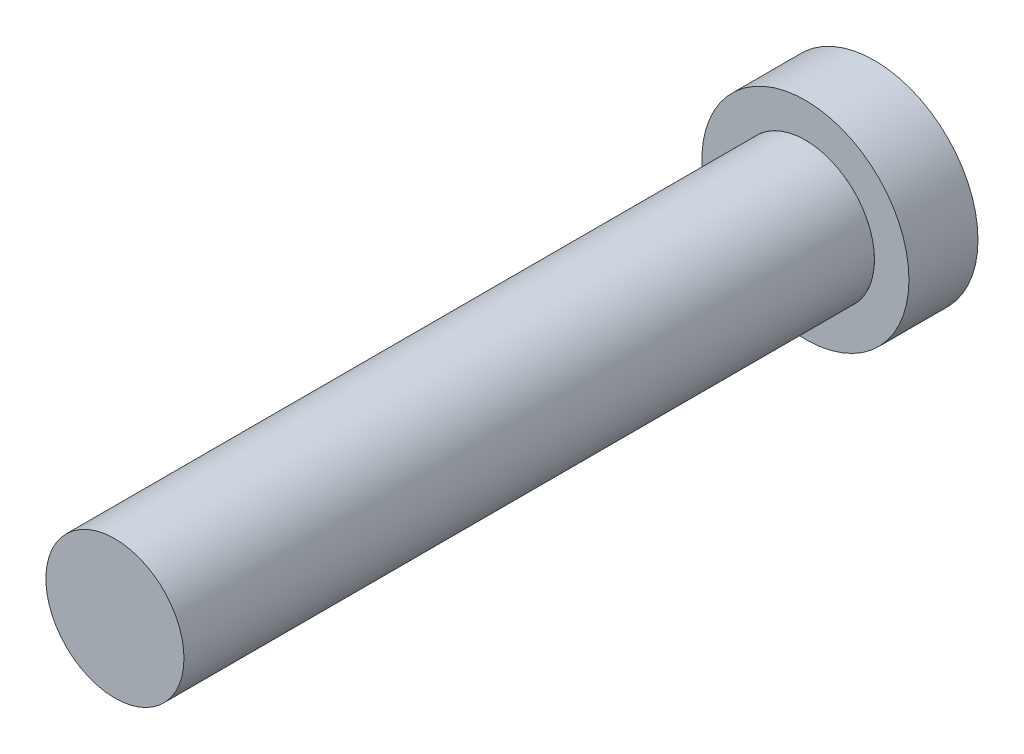
ISO-10303-21;
HEADER;
FILE_DESCRIPTION(('STEP AP214'),'2;1');
FILE_NAME('part.step','',(''),(''),'','','');
FILE_SCHEMA(('AUTOMOTIVE_DESIGN { 1 0 10303 214 1 1 1 1 }'));
ENDSEC;
DATA;
#1=APPLICATION_CONTEXT('core data for automotive mechanical design processes');
#2=APPLICATION_PROTOCOL_DEFINITION('international standard','automotive_design',2000,#1);
#3=PRODUCT_CONTEXT('',#1,'mechanical');
#4=PRODUCT('Part','Part','',(#3));
#5=PRODUCT_RELATED_PRODUCT_CATEGORY('part','',(#4));
#6=PRODUCT_DEFINITION_FORMATION('','',#4);
#7=PRODUCT_DEFINITION_CONTEXT('part definition',#1,'design');
#8=PRODUCT_DEFINITION('design','',#6,#7);
#9=PRODUCT_DEFINITION_SHAPE('','',#8);
#10=(LENGTH_UNIT() NAMED_UNIT(*) SI_UNIT(.MILLI.,.METRE.));
#11=(NAMED_UNIT(*) PLANE_ANGLE_UNIT() SI_UNIT($,.RADIAN.));
#12=(NAMED_UNIT(*) SI_UNIT($,.STERADIAN.) SOLID_ANGLE_UNIT());
#13=UNCERTAINTY_MEASURE_WITH_UNIT(LENGTH_MEASURE(1.E-05),#10,'distance_accuracy_value','');
#14=(GEOMETRIC_REPRESENTATION_CONTEXT(3) GLOBAL_UNCERTAINTY_ASSIGNED_CONTEXT((#13)) GLOBAL_UNIT_ASSIGNED_CONTEXT((#10,
#11,#12)) REPRESENTATION_CONTEXT('',''));
#15=CARTESIAN_POINT('',(0.,0.,0.));
#16=DIRECTION('',(0.,0.,1.));
#17=DIRECTION('',(1.,0.,0.));
#18=AXIS2_PLACEMENT_3D('',#15,#16,#17);
#19=CARTESIAN_POINT('',(0.,0.,-550.));
#20=DIRECTION('',(0.,0.,-1.));
#21=DIRECTION('',(-1.,0.,0.));
#22=AXIS2_PLACEMENT_3D('',#19,#20,#21);
#23=PLANE('',#22);
#24=CARTESIAN_POINT('',(0.,0.,-550.));
#25=DIRECTION('',(0.,0.,-1.));
#26=DIRECTION('',(-1.,0.,0.));
#27=AXIS2_PLACEMENT_3D('',#24,#25,#26);
#28=CIRCLE('',#27,50.);
#29=CARTESIAN_POINT('',(-50.,0.,-550.));
#30=VERTEX_POINT('',#29);
#31=EDGE_CURVE('E11',#30,#30,#28,.T.);
#32=ORIENTED_EDGE('',*,*,#31,.F.);
#33=EDGE_LOOP('',(#32));
#34=FACE_BOUND('',#33,.T.);
#35=CARTESIAN_POINT('',(0.,0.,-550.));
#36=DIRECTION('',(0.,0.,1.));
#37=DIRECTION('',(1.,0.,0.));
#38=AXIS2_PLACEMENT_3D('',#35,#36,#37);
#39=CIRCLE('',#38,75.);
#40=CARTESIAN_POINT('',(75.,0.,-550.));
#41=VERTEX_POINT('',#40);
#42=EDGE_CURVE('E60',#41,#41,#39,.T.);
#43=ORIENTED_EDGE('',*,*,#42,.F.);
#44=EDGE_LOOP('',(#43));
#45=FACE_BOUND('',#44,.T.);
#46=ADVANCED_FACE('F45',(#34,#45),#23,.T.);
#47=CARTESIAN_POINT('',(0.,0.,0.));
#48=DIRECTION('',(0.,0.,1.));
#49=DIRECTION('',(1.,0.,0.));
#50=AXIS2_PLACEMENT_3D('',#47,#48,#49);
#51=CYLINDRICAL_SURFACE('',#50,75.);
#52=ORIENTED_EDGE('',*,*,#42,.T.);
#53=EDGE_LOOP('',(#52));
#54=FACE_BOUND('',#53,.T.);
#55=CARTESIAN_POINT('',(0.,0.,-500.));
#56=DIRECTION('',(0.,0.,1.));
#57=DIRECTION('',(1.,0.,0.));
#58=AXIS2_PLACEMENT_3D('',#55,#56,#57);
#59=CIRCLE('',#58,75.);
#60=CARTESIAN_POINT('',(75.,0.,-500.));
#61=VERTEX_POINT('',#60);
#62=EDGE_CURVE('E56',#61,#61,#59,.T.);
#63=ORIENTED_EDGE('',*,*,#62,.F.);
#64=EDGE_LOOP('',(#63));
#65=FACE_BOUND('',#64,.T.);
#66=ADVANCED_FACE('F64',(#54,#65),#51,.T.);
#67=CARTESIAN_POINT('',(0.,-75.,-500.));
#68=DIRECTION('',(0.,0.,1.));
#69=DIRECTION('',(1.,0.,0.));
#70=AXIS2_PLACEMENT_3D('',#67,#68,#69);
#71=PLANE('',#70);
#72=ORIENTED_EDGE('',*,*,#62,.T.);
#73=EDGE_LOOP('',(#72));
#74=FACE_BOUND('',#73,.T.);
#75=CARTESIAN_POINT('',(0.,0.,-500.));
#76=DIRECTION('',(0.,0.,-1.));
#77=DIRECTION('',(-1.,0.,0.));
#78=AXIS2_PLACEMENT_3D('',#75,#76,#77);
#79=CIRCLE('',#78,50.);
#80=CARTESIAN_POINT('',(-50.,0.,-500.));
#81=VERTEX_POINT('',#80);
#82=EDGE_CURVE('E49',#81,#81,#79,.T.);
#83=ORIENTED_EDGE('',*,*,#82,.T.);
#84=EDGE_LOOP('',(#83));
#85=FACE_BOUND('',#84,.T.);
#86=ADVANCED_FACE('F73',(#74,#85),#71,.T.);
#87=CARTESIAN_POINT('',(0.,0.,-500.));
#88=DIRECTION('',(0.,0.,-1.));
#89=DIRECTION('',(-1.,0.,0.));
#90=AXIS2_PLACEMENT_3D('',#87,#88,#89);
#91=CYLINDRICAL_SURFACE('',#90,50.);
#92=ORIENTED_EDGE('',*,*,#82,.F.);
#93=EDGE_LOOP('',(#92));
#94=FACE_BOUND('',#93,.T.);
#95=ORIENTED_EDGE('',*,*,#31,.T.);
#96=EDGE_LOOP('',(#95));
#97=FACE_BOUND('',#96,.T.);
#98=ADVANCED_FACE('F47',(#94,#97),#91,.F.);
#99=CLOSED_SHELL('',(#46,#66,#86,#98));
#100=MANIFOLD_SOLID_BREP('B2',#99);
#101=CARTESIAN_POINT('',(0.,-50.,0.));
#102=DIRECTION('',(0.,0.,1.));
#103=DIRECTION('',(1.,0.,0.));
#104=AXIS2_PLACEMENT_3D('',#101,#102,#103);
#105=PLANE('',#104);
#106=CARTESIAN_POINT('',(0.,0.,0.));
#107=DIRECTION('',(0.,0.,1.));
#108=DIRECTION('',(1.,0.,0.));
#109=AXIS2_PLACEMENT_3D('',#106,#107,#108);
#110=CIRCLE('',#109,50.);
#111=CARTESIAN_POINT('',(50.,0.,0.));
#112=VERTEX_POINT('',#111);
#113=EDGE_CURVE('E44',#112,#112,#110,.T.);
#114=ORIENTED_EDGE('',*,*,#113,.T.);
#115=EDGE_LOOP('',(#114));
#116=FACE_BOUND('',#115,.T.);
#117=ADVANCED_FACE('F107',(#116),#105,.T.);
#118=CARTESIAN_POINT('',(0.,0.,0.));
#119=DIRECTION('',(0.,0.,1.));
#120=DIRECTION('',(1.,0.,0.));
#121=AXIS2_PLACEMENT_3D('',#118,#119,#120);
#122=CYLINDRICAL_SURFACE('',#121,50.);
#123=CARTESIAN_POINT('',(0.,0.,-500.));
#124=DIRECTION('',(0.,0.,-1.));
#125=DIRECTION('',(-1.,0.,0.));
#126=AXIS2_PLACEMENT_3D('',#123,#124,#125);
#127=CIRCLE('',#126,50.);
#128=CARTESIAN_POINT('',(-50.,0.,-500.));
#129=VERTEX_POINT('',#128);
#130=EDGE_CURVE('E113',#129,#129,#127,.T.);
#131=ORIENTED_EDGE('',*,*,#130,.F.);
#132=EDGE_LOOP('',(#131));
#133=FACE_BOUND('',#132,.T.);
#134=ORIENTED_EDGE('',*,*,#113,.F.);
#135=EDGE_LOOP('',(#134));
#136=FACE_BOUND('',#135,.T.);
#137=ADVANCED_FACE('F121',(#133,#136),#122,.T.);
#138=CARTESIAN_POINT('',(0.,0.,-500.));
#139=DIRECTION('',(0.,0.,-1.));
#140=DIRECTION('',(-1.,0.,0.));
#141=AXIS2_PLACEMENT_3D('',#138,#139,#140);
#142=PLANE('',#141);
#143=ORIENTED_EDGE('',*,*,#130,.T.);
#144=EDGE_LOOP('',(#143));
#145=FACE_BOUND('',#144,.T.);
#146=ADVANCED_FACE('F119',(#145),#142,.T.);
#147=CLOSED_SHELL('',(#117,#137,#146));
#148=MANIFOLD_SOLID_BREP('B6',#147);
#149=ADVANCED_BREP_SHAPE_REPRESENTATION('',(#18,#100,#148),#14);
#150=SHAPE_DEFINITION_REPRESENTATION(#9,#149);
ENDSEC;
END-ISO-10303-21;
